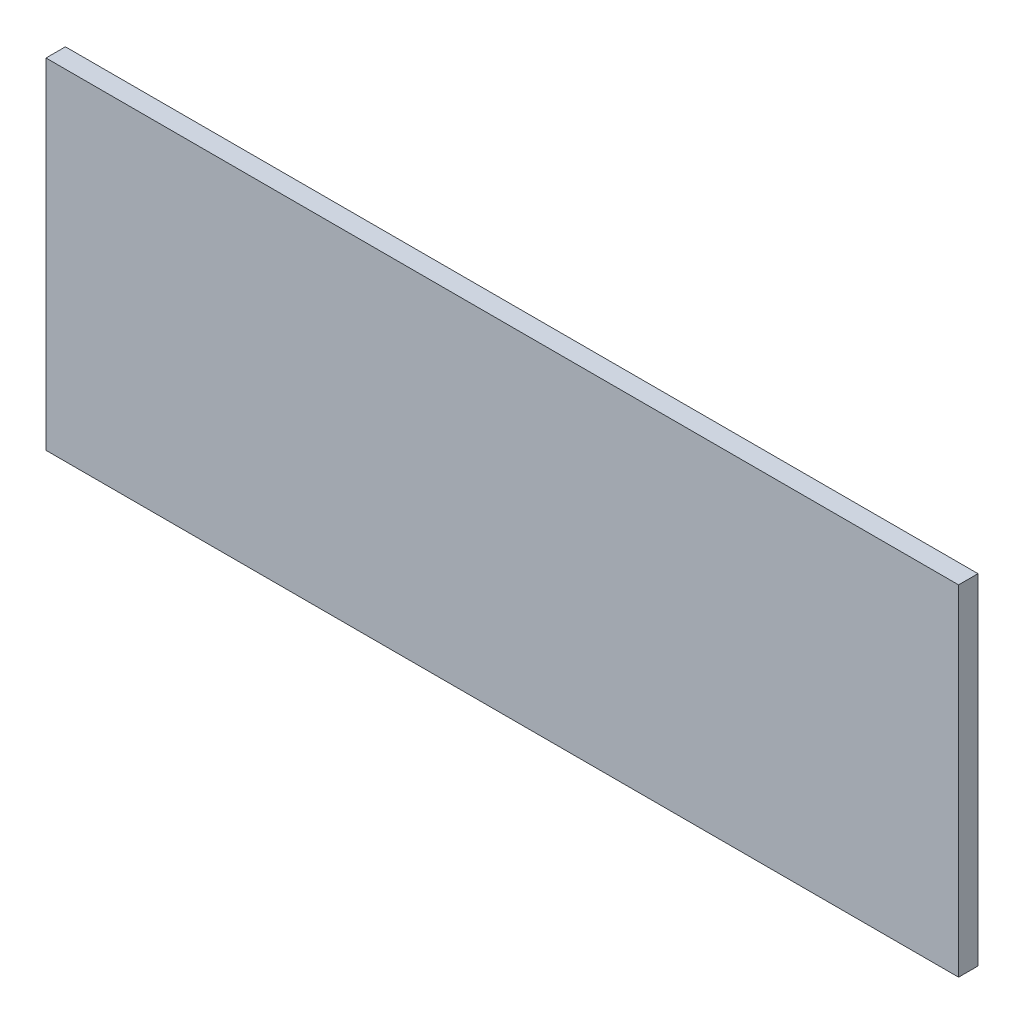
ISO-10303-21;
HEADER;
FILE_DESCRIPTION(('STEP AP214'),'2;1');
FILE_NAME('part.step','',(''),(''),'','','');
FILE_SCHEMA(('AUTOMOTIVE_DESIGN { 1 0 10303 214 1 1 1 1 }'));
ENDSEC;
DATA;
#1=APPLICATION_CONTEXT('core data for automotive mechanical design processes');
#2=APPLICATION_PROTOCOL_DEFINITION('international standard','automotive_design',2000,#1);
#3=PRODUCT_CONTEXT('',#1,'mechanical');
#4=PRODUCT('Part','Part','',(#3));
#5=PRODUCT_RELATED_PRODUCT_CATEGORY('part','',(#4));
#6=PRODUCT_DEFINITION_FORMATION('','',#4);
#7=PRODUCT_DEFINITION_CONTEXT('part definition',#1,'design');
#8=PRODUCT_DEFINITION('design','',#6,#7);
#9=PRODUCT_DEFINITION_SHAPE('','',#8);
#10=(LENGTH_UNIT() NAMED_UNIT(*) SI_UNIT(.MILLI.,.METRE.));
#11=(NAMED_UNIT(*) PLANE_ANGLE_UNIT() SI_UNIT($,.RADIAN.));
#12=(NAMED_UNIT(*) SI_UNIT($,.STERADIAN.) SOLID_ANGLE_UNIT());
#13=UNCERTAINTY_MEASURE_WITH_UNIT(LENGTH_MEASURE(1.E-05),#10,'distance_accuracy_value','');
#14=(GEOMETRIC_REPRESENTATION_CONTEXT(3) GLOBAL_UNCERTAINTY_ASSIGNED_CONTEXT((#13)) GLOBAL_UNIT_ASSIGNED_CONTEXT((#10,
#11,#12)) REPRESENTATION_CONTEXT('',''));
#15=CARTESIAN_POINT('',(0.,0.,0.));
#16=DIRECTION('',(0.,0.,1.));
#17=DIRECTION('',(1.,0.,0.));
#18=AXIS2_PLACEMENT_3D('',#15,#16,#17);
#19=CARTESIAN_POINT('',(0.,0.,10.));
#20=DIRECTION('',(1.,0.,0.));
#21=DIRECTION('',(0.,0.,-1.));
#22=AXIS2_PLACEMENT_3D('',#19,#20,#21);
#23=PLANE('',#22);
#24=DIRECTION('',(0.,-1.,0.));
#25=VECTOR('',#24,1.);
#26=CARTESIAN_POINT('',(0.,0.,0.));
#27=LINE('',#26,#25);
#28=CARTESIAN_POINT('',(0.,175.,0.));
#29=VERTEX_POINT('',#28);
#30=CARTESIAN_POINT('',(0.,0.,0.));
#31=VERTEX_POINT('',#30);
#32=EDGE_CURVE('E96',#29,#31,#27,.T.);
#33=ORIENTED_EDGE('',*,*,#32,.T.);
#34=DIRECTION('',(0.,0.,-1.));
#35=VECTOR('',#34,1.);
#36=CARTESIAN_POINT('',(0.,0.,10.));
#37=LINE('',#36,#35);
#38=CARTESIAN_POINT('',(0.,0.,10.));
#39=VERTEX_POINT('',#38);
#40=EDGE_CURVE('E11',#39,#31,#37,.T.);
#41=ORIENTED_EDGE('',*,*,#40,.F.);
#42=DIRECTION('',(0.,-1.,0.));
#43=VECTOR('',#42,1.);
#44=CARTESIAN_POINT('',(0.,0.,10.));
#45=LINE('',#44,#43);
#46=CARTESIAN_POINT('',(0.,175.,10.));
#47=VERTEX_POINT('',#46);
#48=EDGE_CURVE('E84',#47,#39,#45,.T.);
#49=ORIENTED_EDGE('',*,*,#48,.F.);
#50=DIRECTION('',(0.,0.,-1.));
#51=VECTOR('',#50,1.);
#52=CARTESIAN_POINT('',(0.,175.,10.));
#53=LINE('',#52,#51);
#54=EDGE_CURVE('E92',#47,#29,#53,.T.);
#55=ORIENTED_EDGE('',*,*,#54,.T.);
#56=EDGE_LOOP('',(#33,#41,#49,#55));
#57=FACE_BOUND('',#56,.T.);
#58=ADVANCED_FACE('F33',(#57),#23,.F.);
#59=CARTESIAN_POINT('',(0.,0.,10.));
#60=DIRECTION('',(0.,1.,0.));
#61=DIRECTION('',(0.,0.,1.));
#62=AXIS2_PLACEMENT_3D('',#59,#60,#61);
#63=PLANE('',#62);
#64=DIRECTION('',(1.,0.,0.));
#65=VECTOR('',#64,1.);
#66=CARTESIAN_POINT('',(0.,0.,0.));
#67=LINE('',#66,#65);
#68=CARTESIAN_POINT('',(470.,0.,0.));
#69=VERTEX_POINT('',#68);
#70=EDGE_CURVE('E88',#31,#69,#67,.T.);
#71=ORIENTED_EDGE('',*,*,#70,.T.);
#72=DIRECTION('',(0.,0.,-1.));
#73=VECTOR('',#72,1.);
#74=CARTESIAN_POINT('',(470.,0.,10.));
#75=LINE('',#74,#73);
#76=CARTESIAN_POINT('',(470.,0.,10.));
#77=VERTEX_POINT('',#76);
#78=EDGE_CURVE('E41',#77,#69,#75,.T.);
#79=ORIENTED_EDGE('',*,*,#78,.F.);
#80=DIRECTION('',(1.,0.,0.));
#81=VECTOR('',#80,1.);
#82=CARTESIAN_POINT('',(0.,0.,10.));
#83=LINE('',#82,#81);
#84=EDGE_CURVE('E79',#39,#77,#83,.T.);
#85=ORIENTED_EDGE('',*,*,#84,.F.);
#86=ORIENTED_EDGE('',*,*,#40,.T.);
#87=EDGE_LOOP('',(#71,#79,#85,#86));
#88=FACE_BOUND('',#87,.T.);
#89=ADVANCED_FACE('F87',(#88),#63,.F.);
#90=CARTESIAN_POINT('',(470.,0.,10.));
#91=DIRECTION('',(-1.,0.,0.));
#92=DIRECTION('',(0.,0.,1.));
#93=AXIS2_PLACEMENT_3D('',#90,#91,#92);
#94=PLANE('',#93);
#95=DIRECTION('',(0.,1.,0.));
#96=VECTOR('',#95,1.);
#97=CARTESIAN_POINT('',(470.,0.,0.));
#98=LINE('',#97,#96);
#99=CARTESIAN_POINT('',(470.,175.,0.));
#100=VERTEX_POINT('',#99);
#101=EDGE_CURVE('E66',#69,#100,#98,.T.);
#102=ORIENTED_EDGE('',*,*,#101,.T.);
#103=DIRECTION('',(0.,0.,-1.));
#104=VECTOR('',#103,1.);
#105=CARTESIAN_POINT('',(470.,175.,10.));
#106=LINE('',#105,#104);
#107=CARTESIAN_POINT('',(470.,175.,10.));
#108=VERTEX_POINT('',#107);
#109=EDGE_CURVE('E89',#108,#100,#106,.T.);
#110=ORIENTED_EDGE('',*,*,#109,.F.);
#111=DIRECTION('',(0.,1.,0.));
#112=VECTOR('',#111,1.);
#113=CARTESIAN_POINT('',(470.,0.,10.));
#114=LINE('',#113,#112);
#115=EDGE_CURVE('E82',#77,#108,#114,.T.);
#116=ORIENTED_EDGE('',*,*,#115,.F.);
#117=ORIENTED_EDGE('',*,*,#78,.T.);
#118=EDGE_LOOP('',(#102,#110,#116,#117));
#119=FACE_BOUND('',#118,.T.);
#120=ADVANCED_FACE('F90',(#119),#94,.F.);
#121=CARTESIAN_POINT('',(0.,175.,10.));
#122=DIRECTION('',(0.,-1.,0.));
#123=DIRECTION('',(0.,0.,-1.));
#124=AXIS2_PLACEMENT_3D('',#121,#122,#123);
#125=PLANE('',#124);
#126=DIRECTION('',(-1.,0.,0.));
#127=VECTOR('',#126,1.);
#128=CARTESIAN_POINT('',(0.,175.,0.));
#129=LINE('',#128,#127);
#130=EDGE_CURVE('E72',#100,#29,#129,.T.);
#131=ORIENTED_EDGE('',*,*,#130,.T.);
#132=ORIENTED_EDGE('',*,*,#54,.F.);
#133=DIRECTION('',(-1.,0.,0.));
#134=VECTOR('',#133,1.);
#135=CARTESIAN_POINT('',(0.,175.,10.));
#136=LINE('',#135,#134);
#137=EDGE_CURVE('E49',#108,#47,#136,.T.);
#138=ORIENTED_EDGE('',*,*,#137,.F.);
#139=ORIENTED_EDGE('',*,*,#109,.T.);
#140=EDGE_LOOP('',(#131,#132,#138,#139));
#141=FACE_BOUND('',#140,.T.);
#142=ADVANCED_FACE('F103',(#141),#125,.F.);
#143=CARTESIAN_POINT('',(0.,0.,10.));
#144=DIRECTION('',(0.,0.,-1.));
#145=DIRECTION('',(-1.,0.,0.));
#146=AXIS2_PLACEMENT_3D('',#143,#144,#145);
#147=PLANE('',#146);
#148=ORIENTED_EDGE('',*,*,#48,.T.);
#149=ORIENTED_EDGE('',*,*,#84,.T.);
#150=ORIENTED_EDGE('',*,*,#115,.T.);
#151=ORIENTED_EDGE('',*,*,#137,.T.);
#152=EDGE_LOOP('',(#148,#149,#150,#151));
#153=FACE_BOUND('',#152,.T.);
#154=ADVANCED_FACE('F80',(#153),#147,.F.);
#155=CARTESIAN_POINT('',(0.,0.,0.));
#156=DIRECTION('',(0.,0.,-1.));
#157=DIRECTION('',(-1.,0.,0.));
#158=AXIS2_PLACEMENT_3D('',#155,#156,#157);
#159=PLANE('',#158);
#160=ORIENTED_EDGE('',*,*,#32,.F.);
#161=ORIENTED_EDGE('',*,*,#130,.F.);
#162=ORIENTED_EDGE('',*,*,#101,.F.);
#163=ORIENTED_EDGE('',*,*,#70,.F.);
#164=EDGE_LOOP('',(#160,#161,#162,#163));
#165=FACE_BOUND('',#164,.T.);
#166=ADVANCED_FACE('F106',(#165),#159,.T.);
#167=CLOSED_SHELL('',(#58,#89,#120,#142,#154,#166));
#168=MANIFOLD_SOLID_BREP('B2',#167);
#169=ADVANCED_BREP_SHAPE_REPRESENTATION('',(#18,#168),#14);
#170=SHAPE_DEFINITION_REPRESENTATION(#9,#169);
ENDSEC;
END-ISO-10303-21;
